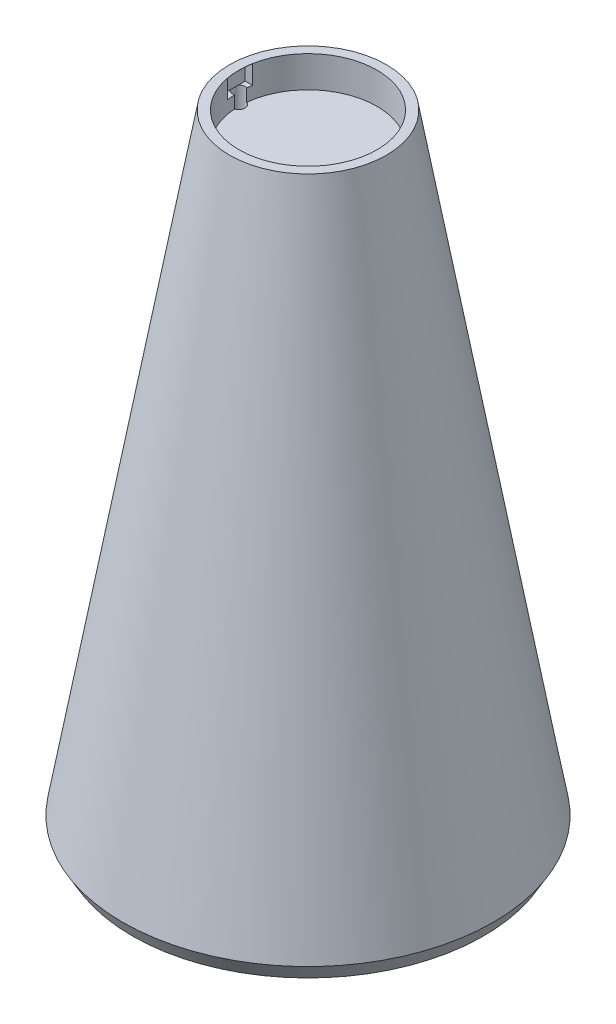
ISO-10303-21;
HEADER;
FILE_DESCRIPTION(('STEP AP214'),'2;1');
FILE_NAME('part.step','',(''),(''),'','','');
FILE_SCHEMA(('AUTOMOTIVE_DESIGN { 1 0 10303 214 1 1 1 1 }'));
ENDSEC;
DATA;
#1=APPLICATION_CONTEXT('core data for automotive mechanical design processes');
#2=APPLICATION_PROTOCOL_DEFINITION('international standard','automotive_design',2000,#1);
#3=PRODUCT_CONTEXT('',#1,'mechanical');
#4=PRODUCT('Part','Part','',(#3));
#5=PRODUCT_RELATED_PRODUCT_CATEGORY('part','',(#4));
#6=PRODUCT_DEFINITION_FORMATION('','',#4);
#7=PRODUCT_DEFINITION_CONTEXT('part definition',#1,'design');
#8=PRODUCT_DEFINITION('design','',#6,#7);
#9=PRODUCT_DEFINITION_SHAPE('','',#8);
#10=(LENGTH_UNIT() NAMED_UNIT(*) SI_UNIT(.MILLI.,.METRE.));
#11=(NAMED_UNIT(*) PLANE_ANGLE_UNIT() SI_UNIT($,.RADIAN.));
#12=(NAMED_UNIT(*) SI_UNIT($,.STERADIAN.) SOLID_ANGLE_UNIT());
#13=UNCERTAINTY_MEASURE_WITH_UNIT(LENGTH_MEASURE(1.E-05),#10,'distance_accuracy_value','');
#14=(GEOMETRIC_REPRESENTATION_CONTEXT(3) GLOBAL_UNCERTAINTY_ASSIGNED_CONTEXT((#13)) GLOBAL_UNIT_ASSIGNED_CONTEXT((#10,
#11,#12)) REPRESENTATION_CONTEXT('',''));
#15=CARTESIAN_POINT('',(0.,0.,0.));
#16=DIRECTION('',(0.,0.,1.));
#17=DIRECTION('',(1.,0.,0.));
#18=AXIS2_PLACEMENT_3D('',#15,#16,#17);
#19=CARTESIAN_POINT('',(-12.,96.9798708619337,2.00094890126522));
#20=DIRECTION('',(0.,-1.,0.));
#21=DIRECTION('',(0.,0.,-1.));
#22=AXIS2_PLACEMENT_3D('',#19,#20,#21);
#23=PLANE('',#22);
#24=CARTESIAN_POINT('',(0.,96.9798708619337,0.));
#25=DIRECTION('',(0.,-1.,0.));
#26=DIRECTION('',(0.,0.,-1.));
#27=AXIS2_PLACEMENT_3D('',#24,#25,#26);
#28=CIRCLE('',#27,11.);
#29=CARTESIAN_POINT('',(-10.9760585331628,96.9798708619337,0.725354448931335));
#30=VERTEX_POINT('',#29);
#31=CARTESIAN_POINT('',(-10.8164783314407,96.9798708619337,2.00094890126522));
#32=VERTEX_POINT('',#31);
#33=EDGE_CURVE('E120',#30,#32,#28,.F.);
#34=ORIENTED_EDGE('',*,*,#33,.F.);
#35=CARTESIAN_POINT('',(-11.2759699273724,96.9798708619337,-0.22861261319567));
#36=DIRECTION('',(0.,1.,0.));
#37=DIRECTION('',(0.,0.,1.));
#38=AXIS2_PLACEMENT_3D('',#35,#36,#37);
#39=CIRCLE('',#38,1.);
#40=CARTESIAN_POINT('',(-12.,96.9798708619337,0.461155792815292));
#41=VERTEX_POINT('',#40);
#42=EDGE_CURVE('E104',#41,#30,#39,.T.);
#43=ORIENTED_EDGE('',*,*,#42,.F.);
#44=DIRECTION('',(0.,0.,-1.));
#45=VECTOR('',#44,1.);
#46=CARTESIAN_POINT('',(-12.,96.9798708619337,2.00094890126522));
#47=LINE('',#46,#45);
#48=CARTESIAN_POINT('',(-12.,96.9798708619337,2.00094890126522));
#49=VERTEX_POINT('',#48);
#50=EDGE_CURVE('E198',#49,#41,#47,.T.);
#51=ORIENTED_EDGE('',*,*,#50,.F.);
#52=DIRECTION('',(1.,0.,0.));
#53=VECTOR('',#52,1.);
#54=CARTESIAN_POINT('',(-12.,96.9798708619337,2.00094890126522));
#55=LINE('',#54,#53);
#56=EDGE_CURVE('E129',#49,#32,#55,.T.);
#57=ORIENTED_EDGE('',*,*,#56,.T.);
#58=EDGE_LOOP('',(#34,#43,#51,#57));
#59=FACE_BOUND('',#58,.T.);
#60=ADVANCED_FACE('F39',(#59),#23,.F.);
#61=CARTESIAN_POINT('',(0.,0.,0.));
#62=DIRECTION('',(0.,1.,0.));
#63=DIRECTION('',(0.,0.,1.));
#64=AXIS2_PLACEMENT_3D('',#61,#62,#63);
#65=PLANE('',#64);
#66=CARTESIAN_POINT('',(0.,0.,0.));
#67=DIRECTION('',(0.,1.,0.));
#68=DIRECTION('',(0.,0.,1.));
#69=AXIS2_PLACEMENT_3D('',#66,#67,#68);
#70=CIRCLE('',#69,28.);
#71=CARTESIAN_POINT('',(0.,0.,28.));
#72=VERTEX_POINT('',#71);
#73=EDGE_CURVE('E12',#72,#72,#70,.F.);
#74=ORIENTED_EDGE('',*,*,#73,.T.);
#75=EDGE_LOOP('',(#74));
#76=FACE_BOUND('',#75,.T.);
#77=CARTESIAN_POINT('',(0.,0.,0.));
#78=DIRECTION('',(0.,1.,0.));
#79=DIRECTION('',(0.,0.,1.));
#80=AXIS2_PLACEMENT_3D('',#77,#78,#79);
#81=CIRCLE('',#80,27.4620074369691);
#82=CARTESIAN_POINT('',(0.,0.,27.4620074369691));
#83=VERTEX_POINT('',#82);
#84=EDGE_CURVE('E125',#83,#83,#81,.T.);
#85=ORIENTED_EDGE('',*,*,#84,.T.);
#86=EDGE_LOOP('',(#85));
#87=FACE_BOUND('',#86,.T.);
#88=ADVANCED_FACE('F162',(#76,#87),#65,.F.);
#89=CARTESIAN_POINT('',(0.,100.,0.));
#90=DIRECTION('',(0.,1.,0.));
#91=DIRECTION('',(0.,0.,1.));
#92=AXIS2_PLACEMENT_3D('',#89,#90,#91);
#93=PLANE('',#92);
#94=CARTESIAN_POINT('',(0.,100.,0.));
#95=DIRECTION('',(0.,1.,0.));
#96=DIRECTION('',(0.,0.,1.));
#97=AXIS2_PLACEMENT_3D('',#94,#95,#96);
#98=CIRCLE('',#97,11.);
#99=CARTESIAN_POINT('',(0.,100.,11.));
#100=VERTEX_POINT('',#99);
#101=EDGE_CURVE('E206',#100,#100,#98,.T.);
#102=ORIENTED_EDGE('',*,*,#101,.F.);
#103=EDGE_LOOP('',(#102));
#104=FACE_BOUND('',#103,.T.);
#105=CARTESIAN_POINT('',(0.,100.,0.));
#106=DIRECTION('',(0.,1.,0.));
#107=DIRECTION('',(0.,0.,1.));
#108=AXIS2_PLACEMENT_3D('',#105,#106,#107);
#109=CIRCLE('',#108,12.5);
#110=CARTESIAN_POINT('',(0.,100.,12.5));
#111=VERTEX_POINT('',#110);
#112=EDGE_CURVE('E213',#111,#111,#109,.T.);
#113=ORIENTED_EDGE('',*,*,#112,.T.);
#114=EDGE_LOOP('',(#113));
#115=FACE_BOUND('',#114,.T.);
#116=ADVANCED_FACE('F169',(#104,#115),#93,.T.);
#117=CARTESIAN_POINT('',(0.,100.,0.));
#118=DIRECTION('',(0.,-1.,0.));
#119=DIRECTION('',(0.,0.,-1.));
#120=AXIS2_PLACEMENT_3D('',#117,#118,#119);
#121=CONICAL_SURFACE('',#120,12.5,0.173245666452365);
#122=CARTESIAN_POINT('',(0.,2.65833625892663,0.));
#123=DIRECTION('',(0.,-1.,0.));
#124=DIRECTION('',(0.,0.,-1.));
#125=AXIS2_PLACEMENT_3D('',#122,#123,#124);
#126=CIRCLE('',#125,29.5347911546878);
#127=CARTESIAN_POINT('',(0.,2.65833625892663,-29.5347911546878));
#128=VERTEX_POINT('',#127);
#129=EDGE_CURVE('E48',#128,#128,#126,.F.);
#130=ORIENTED_EDGE('',*,*,#129,.T.);
#131=EDGE_LOOP('',(#130));
#132=FACE_BOUND('',#131,.T.);
#133=ORIENTED_EDGE('',*,*,#112,.F.);
#134=EDGE_LOOP('',(#133));
#135=FACE_BOUND('',#134,.T.);
#136=ADVANCED_FACE('F225',(#132,#135),#121,.T.);
#137=CARTESIAN_POINT('',(0.,95.,0.));
#138=DIRECTION('',(0.,1.,0.));
#139=DIRECTION('',(0.,0.,1.));
#140=AXIS2_PLACEMENT_3D('',#137,#138,#139);
#141=CYLINDRICAL_SURFACE('',#140,11.);
#142=CARTESIAN_POINT('',(0.,95.,0.));
#143=DIRECTION('',(0.,1.,0.));
#144=DIRECTION('',(0.,0.,1.));
#145=AXIS2_PLACEMENT_3D('',#142,#143,#144);
#146=CIRCLE('',#145,11.);
#147=CARTESIAN_POINT('',(-10.9760585331628,95.,0.725354448931337));
#148=VERTEX_POINT('',#147);
#149=CARTESIAN_POINT('',(-10.9376388160996,95.,-1.16963974306224));
#150=VERTEX_POINT('',#149);
#151=EDGE_CURVE('E124',#148,#150,#146,.T.);
#152=ORIENTED_EDGE('',*,*,#151,.F.);
#153=DIRECTION('',(0.,1.,0.));
#154=VECTOR('',#153,1.);
#155=CARTESIAN_POINT('',(-10.9760585331628,48.4898854309669,0.725354448931335));
#156=LINE('',#155,#154);
#157=EDGE_CURVE('E107',#148,#30,#156,.T.);
#158=ORIENTED_EDGE('',*,*,#157,.T.);
#159=ORIENTED_EDGE('',*,*,#33,.T.);
#160=DIRECTION('',(0.,1.,0.));
#161=VECTOR('',#160,1.);
#162=CARTESIAN_POINT('',(-10.8164783314407,95.,2.00094890126522));
#163=LINE('',#162,#161);
#164=CARTESIAN_POINT('',(-10.8164783314407,99.9798708619337,2.00094890126522));
#165=VERTEX_POINT('',#164);
#166=EDGE_CURVE('E131',#32,#165,#163,.T.);
#167=ORIENTED_EDGE('',*,*,#166,.T.);
#168=CARTESIAN_POINT('',(0.,99.9798708619337,0.));
#169=DIRECTION('',(0.,1.,0.));
#170=DIRECTION('',(0.,0.,1.));
#171=AXIS2_PLACEMENT_3D('',#168,#169,#170);
#172=CIRCLE('',#171,11.);
#173=CARTESIAN_POINT('',(-10.8168292352541,99.9798708619337,-1.99905109873478));
#174=VERTEX_POINT('',#173);
#175=EDGE_CURVE('E135',#165,#174,#172,.F.);
#176=ORIENTED_EDGE('',*,*,#175,.T.);
#177=DIRECTION('',(0.,1.,0.));
#178=VECTOR('',#177,1.);
#179=CARTESIAN_POINT('',(-10.8168292352541,95.,-1.99905109873478));
#180=LINE('',#179,#178);
#181=CARTESIAN_POINT('',(-10.8168292352541,96.9798708619337,-1.99905109873478));
#182=VERTEX_POINT('',#181);
#183=EDGE_CURVE('E134',#174,#182,#180,.F.);
#184=ORIENTED_EDGE('',*,*,#183,.T.);
#185=CARTESIAN_POINT('',(-10.9376388160996,96.9798708619337,-1.16963974306224));
#186=VERTEX_POINT('',#185);
#187=EDGE_CURVE('E130',#182,#186,#28,.F.);
#188=ORIENTED_EDGE('',*,*,#187,.T.);
#189=DIRECTION('',(0.,1.,0.));
#190=VECTOR('',#189,1.);
#191=CARTESIAN_POINT('',(-10.9376388160996,48.4898854309669,-1.16963974306224));
#192=LINE('',#191,#190);
#193=EDGE_CURVE('E126',#186,#150,#192,.F.);
#194=ORIENTED_EDGE('',*,*,#193,.T.);
#195=EDGE_LOOP('',(#152,#158,#159,#167,#176,#184,#188,#194));
#196=FACE_BOUND('',#195,.T.);
#197=ORIENTED_EDGE('',*,*,#101,.T.);
#198=EDGE_LOOP('',(#197));
#199=FACE_BOUND('',#198,.T.);
#200=ADVANCED_FACE('F117',(#196,#199),#141,.F.);
#201=CARTESIAN_POINT('',(0.,95.,0.));
#202=DIRECTION('',(0.,1.,0.));
#203=DIRECTION('',(0.,0.,1.));
#204=AXIS2_PLACEMENT_3D('',#201,#202,#203);
#205=PLANE('',#204);
#206=CARTESIAN_POINT('',(-11.2759699273724,95.,-0.22861261319567));
#207=DIRECTION('',(0.,1.,0.));
#208=DIRECTION('',(0.,0.,1.));
#209=AXIS2_PLACEMENT_3D('',#206,#207,#208);
#210=CIRCLE('',#209,1.);
#211=EDGE_CURVE('E266',#148,#150,#210,.T.);
#212=ORIENTED_EDGE('',*,*,#211,.F.);
#213=ORIENTED_EDGE('',*,*,#151,.T.);
#214=EDGE_LOOP('',(#212,#213));
#215=FACE_BOUND('',#214,.T.);
#216=ADVANCED_FACE('F183',(#215),#205,.T.);
#217=CARTESIAN_POINT('',(-12.,99.9798708619337,-1.99905109873478));
#218=DIRECTION('',(0.,0.,-1.));
#219=DIRECTION('',(0.,1.,0.));
#220=AXIS2_PLACEMENT_3D('',#217,#218,#219);
#221=PLANE('',#220);
#222=DIRECTION('',(1.,0.,0.));
#223=VECTOR('',#222,1.);
#224=CARTESIAN_POINT('',(-12.,99.9798708619337,-1.99905109873478));
#225=LINE('',#224,#223);
#226=CARTESIAN_POINT('',(-12.,99.9798708619337,-1.99905109873478));
#227=VERTEX_POINT('',#226);
#228=EDGE_CURVE('E201',#227,#174,#225,.T.);
#229=ORIENTED_EDGE('',*,*,#228,.F.);
#230=DIRECTION('',(0.,1.,0.));
#231=VECTOR('',#230,1.);
#232=CARTESIAN_POINT('',(-12.,99.9798708619337,-1.99905109873478));
#233=LINE('',#232,#231);
#234=CARTESIAN_POINT('',(-12.,96.9798708619337,-1.99905109873478));
#235=VERTEX_POINT('',#234);
#236=EDGE_CURVE('E257',#235,#227,#233,.T.);
#237=ORIENTED_EDGE('',*,*,#236,.F.);
#238=DIRECTION('',(1.,0.,0.));
#239=VECTOR('',#238,1.);
#240=CARTESIAN_POINT('',(-12.,96.9798708619337,-1.99905109873478));
#241=LINE('',#240,#239);
#242=EDGE_CURVE('E191',#235,#182,#241,.T.);
#243=ORIENTED_EDGE('',*,*,#242,.T.);
#244=ORIENTED_EDGE('',*,*,#183,.F.);
#245=EDGE_LOOP('',(#229,#237,#243,#244));
#246=FACE_BOUND('',#245,.T.);
#247=ADVANCED_FACE('F175',(#246),#221,.F.);
#248=CARTESIAN_POINT('',(-12.,96.9798708619337,-0.918381019206632));
#249=VERTEX_POINT('',#248);
#250=EDGE_CURVE('E188',#249,#235,#47,.T.);
#251=ORIENTED_EDGE('',*,*,#250,.F.);
#252=EDGE_CURVE('E55',#186,#249,#39,.T.);
#253=ORIENTED_EDGE('',*,*,#252,.F.);
#254=ORIENTED_EDGE('',*,*,#187,.F.);
#255=ORIENTED_EDGE('',*,*,#242,.F.);
#256=EDGE_LOOP('',(#251,#253,#254,#255));
#257=FACE_BOUND('',#256,.T.);
#258=ADVANCED_FACE('F164',(#257),#23,.F.);
#259=CARTESIAN_POINT('',(-12.,99.9798708619337,2.00094890126522));
#260=DIRECTION('',(0.,0.,1.));
#261=DIRECTION('',(0.,-1.,0.));
#262=AXIS2_PLACEMENT_3D('',#259,#260,#261);
#263=PLANE('',#262);
#264=ORIENTED_EDGE('',*,*,#56,.F.);
#265=DIRECTION('',(0.,-1.,0.));
#266=VECTOR('',#265,1.);
#267=CARTESIAN_POINT('',(-12.,99.9798708619337,2.00094890126522));
#268=LINE('',#267,#266);
#269=CARTESIAN_POINT('',(-12.,99.9798708619337,2.00094890126522));
#270=VERTEX_POINT('',#269);
#271=EDGE_CURVE('E196',#270,#49,#268,.T.);
#272=ORIENTED_EDGE('',*,*,#271,.F.);
#273=DIRECTION('',(1.,0.,0.));
#274=VECTOR('',#273,1.);
#275=CARTESIAN_POINT('',(-12.,99.9798708619337,2.00094890126522));
#276=LINE('',#275,#274);
#277=EDGE_CURVE('E208',#270,#165,#276,.T.);
#278=ORIENTED_EDGE('',*,*,#277,.T.);
#279=ORIENTED_EDGE('',*,*,#166,.F.);
#280=EDGE_LOOP('',(#264,#272,#278,#279));
#281=FACE_BOUND('',#280,.T.);
#282=ADVANCED_FACE('F174',(#281),#263,.F.);
#283=CARTESIAN_POINT('',(-12.,99.9798708619337,2.00094890126522));
#284=DIRECTION('',(0.,1.,0.));
#285=DIRECTION('',(0.,0.,1.));
#286=AXIS2_PLACEMENT_3D('',#283,#284,#285);
#287=PLANE('',#286);
#288=ORIENTED_EDGE('',*,*,#277,.F.);
#289=DIRECTION('',(0.,0.,1.));
#290=VECTOR('',#289,1.);
#291=CARTESIAN_POINT('',(-12.,99.9798708619337,2.00094890126522));
#292=LINE('',#291,#290);
#293=EDGE_CURVE('E256',#227,#270,#292,.T.);
#294=ORIENTED_EDGE('',*,*,#293,.F.);
#295=ORIENTED_EDGE('',*,*,#228,.T.);
#296=ORIENTED_EDGE('',*,*,#175,.F.);
#297=EDGE_LOOP('',(#288,#294,#295,#296));
#298=FACE_BOUND('',#297,.T.);
#299=ADVANCED_FACE('F181',(#298),#287,.F.);
#300=CARTESIAN_POINT('',(-12.,0.,0.));
#301=DIRECTION('',(1.,0.,0.));
#302=DIRECTION('',(0.,0.,-1.));
#303=AXIS2_PLACEMENT_3D('',#300,#301,#302);
#304=PLANE('',#303);
#305=ORIENTED_EDGE('',*,*,#236,.T.);
#306=ORIENTED_EDGE('',*,*,#293,.T.);
#307=ORIENTED_EDGE('',*,*,#271,.T.);
#308=ORIENTED_EDGE('',*,*,#50,.T.);
#309=EDGE_CURVE('E195',#41,#249,#47,.T.);
#310=ORIENTED_EDGE('',*,*,#309,.T.);
#311=ORIENTED_EDGE('',*,*,#250,.T.);
#312=EDGE_LOOP('',(#305,#306,#307,#308,#310,#311));
#313=FACE_BOUND('',#312,.T.);
#314=ADVANCED_FACE('F199',(#313),#304,.T.);
#315=CARTESIAN_POINT('',(0.,92.5,0.));
#316=DIRECTION('',(0.,1.,0.));
#317=DIRECTION('',(0.,0.,1.));
#318=AXIS2_PLACEMENT_3D('',#315,#316,#317);
#319=PLANE('',#318);
#320=CARTESIAN_POINT('',(0.,92.5,0.));
#321=DIRECTION('',(0.,1.,0.));
#322=DIRECTION('',(0.,0.,1.));
#323=AXIS2_PLACEMENT_3D('',#320,#321,#322);
#324=CIRCLE('',#323,11.2745074369691);
#325=CARTESIAN_POINT('',(-11.2481144176922,92.5,0.770999346807037));
#326=VERTEX_POINT('',#325);
#327=CARTESIAN_POINT('',(-11.207621058476,92.5,-1.2262740949221));
#328=VERTEX_POINT('',#327);
#329=EDGE_CURVE('E258',#326,#328,#324,.T.);
#330=ORIENTED_EDGE('',*,*,#329,.F.);
#331=CARTESIAN_POINT('',(-11.2759699273724,92.5,-0.22861261319567));
#332=DIRECTION('',(0.,1.,0.));
#333=DIRECTION('',(0.,0.,1.));
#334=AXIS2_PLACEMENT_3D('',#331,#332,#333);
#335=CIRCLE('',#334,1.);
#336=EDGE_CURVE('E62',#326,#328,#335,.T.);
#337=ORIENTED_EDGE('',*,*,#336,.T.);
#338=EDGE_LOOP('',(#330,#337));
#339=FACE_BOUND('',#338,.T.);
#340=ADVANCED_FACE('F270',(#339),#319,.F.);
#341=CARTESIAN_POINT('',(0.,99.5690491706194,0.));
#342=DIRECTION('',(0.,-1.,0.));
#343=DIRECTION('',(0.,0.,-1.));
#344=AXIS2_PLACEMENT_3D('',#341,#342,#343);
#345=CONICAL_SURFACE('',#344,10.0374238321107,0.173245666452365);
#346=ORIENTED_EDGE('',*,*,#329,.T.);
#347=CARTESIAN_POINT('',(-11.2075861116226,92.5002,-1.22627170013043));
#348=CARTESIAN_POINT('',(-11.2362637215022,92.3360793758712,-1.22822727098655));
#349=CARTESIAN_POINT('',(-11.2650744687762,92.171966021664,-1.22896938224297));
#350=CARTESIAN_POINT('',(-11.3229587199368,91.8437833389047,-1.22793013561898));
#351=CARTESIAN_POINT('',(-11.3520322401076,91.6797140137389,-1.22614862026812));
#352=CARTESIAN_POINT('',(-11.4104873418133,91.3513750211302,-1.21995975419223));
#353=CARTESIAN_POINT('',(-11.4398693825512,91.1871055225337,-1.21554769701065));
#354=CARTESIAN_POINT('',(-11.498883669363,90.8587142086731,-1.20391491327293));
#355=CARTESIAN_POINT('',(-11.5285159089237,90.6945923896869,-1.19669425961252));
#356=CARTESIAN_POINT('',(-11.5880312909594,90.3665184696548,-1.17918115533776));
#357=CARTESIAN_POINT('',(-11.6179144876315,90.202566414331,-1.16888802369465));
#358=CARTESIAN_POINT('',(-11.6779155559688,89.8749597916739,-1.14484666609965));
#359=CARTESIAN_POINT('',(-11.7080334222749,89.711305217652,-1.13109851882395));
#360=CARTESIAN_POINT('',(-11.7684740915092,89.3845104771086,-1.09959073073304));
#361=CARTESIAN_POINT('',(-11.7987967683926,89.221370071307,-1.08183337160265));
#362=CARTESIAN_POINT('',(-11.859635197097,88.8957521589898,-1.04142763137156));
#363=CARTESIAN_POINT('',(-11.8901509186019,88.7332745546702,-1.01878000060536));
#364=CARTESIAN_POINT('',(-11.9513543112038,88.4092351141238,-0.967177105813656));
#365=CARTESIAN_POINT('',(-11.982042055209,88.24767373552,-0.938218933331299));
#366=CARTESIAN_POINT('',(-12.0281171230322,88.0066800305691,-0.887993831917978));
#367=CARTESIAN_POINT('',(-12.0434886324519,87.9265430068608,-0.870112652004079));
#368=CARTESIAN_POINT('',(-12.0742088668828,87.7669792995538,-0.831460997192175));
#369=CARTESIAN_POINT('',(-12.0895575964785,87.6875524500174,-0.810691217064779));
#370=CARTESIAN_POINT('',(-12.1202179738481,87.5295834530561,-0.765274720950162));
#371=CARTESIAN_POINT('',(-12.1355294771147,87.4510435011378,-0.7406199943406));
#372=CARTESIAN_POINT('',(-12.1583274714264,87.3347745294942,-0.699448430832877));
#373=CARTESIAN_POINT('',(-12.1658906801481,87.2963149097145,-0.685043777545995));
#374=CARTESIAN_POINT('',(-12.1809317926073,87.220100484268,-0.654449204795142));
#375=CARTESIAN_POINT('',(-12.1884097282441,87.1823454114375,-0.638259978814213));
#376=CARTESIAN_POINT('',(-12.2015071825375,87.1165228212703,-0.607546160758866));
#377=CARTESIAN_POINT('',(-12.2071559486338,87.0882370670664,-0.593504610591913));
#378=CARTESIAN_POINT('',(-12.2183363403111,87.032513198787,-0.563578666176719));
#379=CARTESIAN_POINT('',(-12.2238676176605,87.0050775169825,-0.547689509366913));
#380=CARTESIAN_POINT('',(-12.2347521821958,86.9514489517588,-0.513333402085467));
#381=CARTESIAN_POINT('',(-12.2401033497216,86.9252699115729,-0.49484396669171));
#382=CARTESIAN_POINT('',(-12.2503642295223,86.8756265647701,-0.454428235099008));
#383=CARTESIAN_POINT('',(-12.2552760821882,86.8521489157675,-0.432520211990452));
#384=CARTESIAN_POINT('',(-12.2615478776601,86.8228660718726,-0.398134343030898));
#385=CARTESIAN_POINT('',(-12.2632979133338,86.8147875635952,-0.387687490144111));
#386=CARTESIAN_POINT('',(-12.2665701644037,86.7999298656223,-0.365848291568843));
#387=CARTESIAN_POINT('',(-12.2680922797506,86.7931512461698,-0.35445553405143));
#388=CARTESIAN_POINT('',(-12.2708332914338,86.7813055590844,-0.3305585758638));
#389=CARTESIAN_POINT('',(-12.2720478356438,86.776262729707,-0.31804149082606));
#390=CARTESIAN_POINT('',(-12.274025869797,86.7686252561975,-0.292252977181838));
#391=CARTESIAN_POINT('',(-12.2747905483118,86.7660241499469,-0.278983638822586));
#392=CARTESIAN_POINT('',(-12.2757332711826,86.7637882076975,-0.253500375863877));
#393=CARTESIAN_POINT('',(-12.2759619552651,86.7638848801783,-0.24131222625377));
#394=CARTESIAN_POINT('',(-12.2759775053197,86.7663720540237,-0.217168978559898));
#395=CARTESIAN_POINT('',(-12.2757639330308,86.7687648294879,-0.205214123513215));
#396=CARTESIAN_POINT('',(-12.2748900027495,86.7760043462603,-0.180283985286168));
#397=CARTESIAN_POINT('',(-12.27417150282,86.7811467203066,-0.167398826534538));
#398=CARTESIAN_POINT('',(-12.2723439235563,86.7933773852022,-0.142624866307737));
#399=CARTESIAN_POINT('',(-12.271234088195,86.8004694367785,-0.130738048978005));
#400=CARTESIAN_POINT('',(-12.2678533729834,86.8214977623558,-0.0999688417110791));
#401=CARTESIAN_POINT('',(-12.2653140836704,86.8367459437046,-0.0820264050730838));
#402=CARTESIAN_POINT('',(-12.2597575008279,86.8695175175988,-0.0484708362950832));
#403=CARTESIAN_POINT('',(-12.2567387920551,86.8870476178162,-0.0328648750601657));
#404=CARTESIAN_POINT('',(-12.2488123231616,86.9326545113745,0.00396447867251259));
#405=CARTESIAN_POINT('',(-12.2437186378737,86.9615978861627,0.0240605374965652));
#406=CARTESIAN_POINT('',(-12.2331608557792,87.021178503369,0.061491694782281));
#407=CARTESIAN_POINT('',(-12.2276959150186,87.0518195738062,0.0788201806795812));
#408=CARTESIAN_POINT('',(-12.216505366892,87.1143090313089,0.11152443289214));
#409=CARTESIAN_POINT('',(-12.2107784028059,87.1461635138061,0.126887975588515));
#410=CARTESIAN_POINT('',(-12.1991782086884,87.2105168807849,0.1560041778695));
#411=CARTESIAN_POINT('',(-12.193305159132,87.2430149609366,0.16975871598765));
#412=CARTESIAN_POINT('',(-12.1749041675529,87.344658920445,0.210528555162111));
#413=CARTESIAN_POINT('',(-12.1621925030159,87.4146263603321,0.235405633996658));
#414=CARTESIAN_POINT('',(-12.1365118952585,87.5557411747356,0.28143978220573));
#415=CARTESIAN_POINT('',(-12.1235427762837,87.6268893494509,0.302594205769471));
#416=CARTESIAN_POINT('',(-12.0974216171867,87.7700846247654,0.34215928500606));
#417=CARTESIAN_POINT('',(-12.0842692299961,87.8421333931117,0.360563633825285));
#418=CARTESIAN_POINT('',(-12.0578665538167,87.9867427709182,0.395173180012964));
#419=CARTESIAN_POINT('',(-12.0446162516254,88.05930344934,0.411378074894151));
#420=CARTESIAN_POINT('',(-12.0047163585132,88.2778463103769,0.457383368087143));
#421=CARTESIAN_POINT('',(-11.9779746813763,88.4243779182924,0.484492715416416));
#422=CARTESIAN_POINT('',(-11.9244463687807,88.7180603999235,0.533477155904304));
#423=CARTESIAN_POINT('',(-11.8976598472149,88.8652101320421,0.555359460756101));
#424=CARTESIAN_POINT('',(-11.8443250011098,89.1587070438052,0.594833429363123));
#425=CARTESIAN_POINT('',(-11.8177767409821,89.3050492374619,0.612462540190514));
#426=CARTESIAN_POINT('',(-11.7647182037819,89.5981092038878,0.644358967916266));
#427=CARTESIAN_POINT('',(-11.7382079292548,89.7448270001433,0.65862606912786));
#428=CARTESIAN_POINT('',(-11.6587338051067,90.1856375877247,0.697118151415023));
#429=CARTESIAN_POINT('',(-11.6058726352954,90.4801347828689,0.717001773207271));
#430=CARTESIAN_POINT('',(-11.527554372018,90.9186014898626,0.739586357655934));
#431=CARTESIAN_POINT('',(-11.5019346690571,91.0623781174335,0.745871154577482));
#432=CARTESIAN_POINT('',(-11.4508031908288,91.3500314429147,0.756332351894987));
#433=CARTESIAN_POINT('',(-11.4252914166744,91.4939081418392,0.760508730599433));
#434=CARTESIAN_POINT('',(-11.3744241360079,91.7815029840757,0.766858496134421));
#435=CARTESIAN_POINT('',(-11.3490684491081,91.9252210294673,0.769034963799021));
#436=CARTESIAN_POINT('',(-11.2984802778812,92.2126906203273,0.77145323863961));
#437=CARTESIAN_POINT('',(-11.2732477897671,92.3564421646218,0.771695105661726));
#438=CARTESIAN_POINT('',(-11.248079402492,92.5002000000001,0.770998370448416));
#439=B_SPLINE_CURVE_WITH_KNOTS('',3,(#347,#348,#349,#350,#351,#352,#353,#354,#355,#356,#357,
#358,#359,#360,#361,#362,#363,#364,#365,#366,#367,#368,#369,#370,#371,#372,#373,#374,#375,#376,
#377,#378,#379,#380,#381,#382,#383,#384,#385,#386,#387,#388,#389,#390,#391,#392,#393,#394,#395,
#396,#397,#398,#399,#400,#401,#402,#403,#404,#405,#406,#407,#408,#409,#410,#411,#412,#413,#414,
#415,#416,#417,#418,#419,#420,#421,#422,#423,#424,#425,#426,#427,#428,#429,#430,#431,#432,#433,
#434,#435,#436,#437,#438),.UNSPECIFIED.,.F.,.F.,(4,2,2,2,2,2,2,2,2,2,2,2,2,2,2,2,2,2,2,2,2,2,2,
2,2,2,2,2,2,2,2,2,2,2,2,2,2,2,2,2,2,2,2,2,2,4),(0.,0.499853974394221,0.999739140288741,
1.50052137527973,2.00129061358323,2.50217093220077,3.00303984601309,3.50362442535715,
4.00413225245889,4.50487124764304,4.75543326700063,5.00593512468215,5.25696043546844,
5.3822083483897,5.50740776055166,5.60360660400881,5.70005915772205,5.79740389108398,
5.89424507534058,5.93413552360253,5.97404343140895,6.01448792386814,6.05482507405211,
6.09116351053951,6.12753797441985,6.16898399889756,6.21051053630902,6.28115857777054,
6.35201918688636,6.45855395776377,6.56533958256476,6.67276015969103,6.78005404304802,
7.00588719306704,7.23188020734352,7.45838379788026,7.68491850758583,8.13896750581246,
8.5923863917776,9.04165419322634,9.49095080921326,10.3903203159576,10.8288414530332,
11.267367101544,11.7052160695192,12.1430514927524),.UNSPECIFIED.);
#440=EDGE_CURVE('E141',#328,#326,#439,.T.);
#441=ORIENTED_EDGE('',*,*,#440,.T.);
#442=EDGE_LOOP('',(#346,#441));
#443=FACE_BOUND('',#442,.T.);
#444=ORIENTED_EDGE('',*,*,#84,.F.);
#445=EDGE_LOOP('',(#444));
#446=FACE_BOUND('',#445,.T.);
#447=ADVANCED_FACE('F148',(#443,#446),#345,.F.);
#448=CARTESIAN_POINT('',(-11.2759699273724,-0.000100000000002876,-0.22861261319567));
#449=DIRECTION('',(0.,1.,0.));
#450=DIRECTION('',(0.,0.,1.));
#451=AXIS2_PLACEMENT_3D('',#448,#449,#450);
#452=CYLINDRICAL_SURFACE('',#451,1.);
#453=ORIENTED_EDGE('',*,*,#440,.F.);
#454=ORIENTED_EDGE('',*,*,#336,.F.);
#455=EDGE_LOOP('',(#453,#454));
#456=FACE_BOUND('',#455,.T.);
#457=ORIENTED_EDGE('',*,*,#211,.T.);
#458=ORIENTED_EDGE('',*,*,#193,.F.);
#459=ORIENTED_EDGE('',*,*,#252,.T.);
#460=EDGE_CURVE('E109',#249,#41,#39,.T.);
#461=ORIENTED_EDGE('',*,*,#460,.T.);
#462=ORIENTED_EDGE('',*,*,#42,.T.);
#463=ORIENTED_EDGE('',*,*,#157,.F.);
#464=EDGE_LOOP('',(#457,#458,#459,#461,#462,#463));
#465=FACE_BOUND('',#464,.T.);
#466=ADVANCED_FACE('F106',(#456,#465),#452,.F.);
#467=CARTESIAN_POINT('',(-11.2759699273724,96.9798708619337,-0.22861261319567));
#468=DIRECTION('',(0.,1.,0.));
#469=DIRECTION('',(0.,0.,1.));
#470=AXIS2_PLACEMENT_3D('',#467,#468,#469);
#471=PLANE('',#470);
#472=ORIENTED_EDGE('',*,*,#309,.F.);
#473=ORIENTED_EDGE('',*,*,#460,.F.);
#474=EDGE_LOOP('',(#472,#473));
#475=FACE_BOUND('',#474,.T.);
#476=ADVANCED_FACE('F154',(#475),#471,.F.);
#477=CARTESIAN_POINT('',(0.,2.65833625892663,0.));
#478=DIRECTION('',(0.,1.,0.));
#479=DIRECTION('',(0.,0.,1.));
#480=AXIS2_PLACEMENT_3D('',#477,#478,#479);
#481=CONICAL_SURFACE('',#480,29.5347911546878,0.5235987755983);
#482=ORIENTED_EDGE('',*,*,#73,.F.);
#483=EDGE_LOOP('',(#482));
#484=FACE_BOUND('',#483,.T.);
#485=ORIENTED_EDGE('',*,*,#129,.F.);
#486=EDGE_LOOP('',(#485));
#487=FACE_BOUND('',#486,.T.);
#488=ADVANCED_FACE('F42',(#484,#487),#481,.T.);
#489=CLOSED_SHELL('',(#60,#88,#116,#136,#200,#216,#247,#258,#282,#299,#314,#340,#447,#466,#476,#488));
#490=MANIFOLD_SOLID_BREP('B2',#489);
#491=ADVANCED_BREP_SHAPE_REPRESENTATION('',(#18,#490),#14);
#492=SHAPE_DEFINITION_REPRESENTATION(#9,#491);
ENDSEC;
END-ISO-10303-21;
